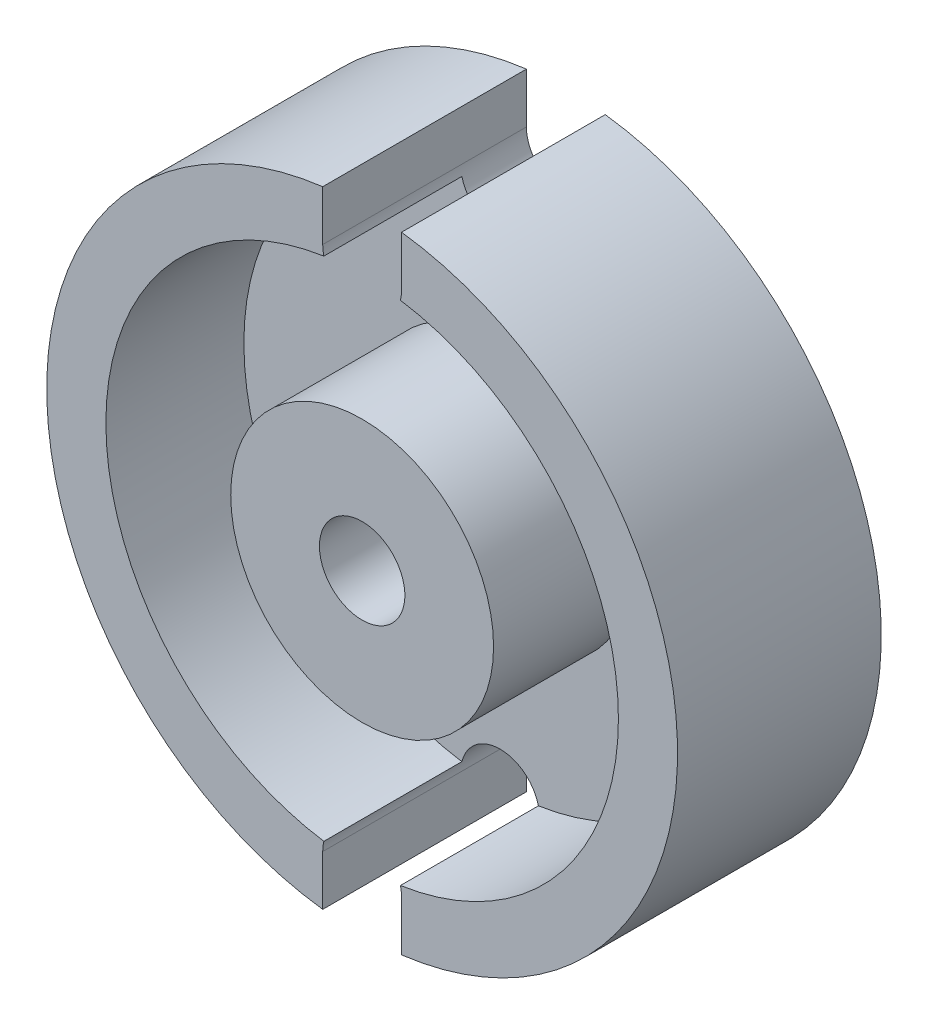
ISO-10303-21;
HEADER;
FILE_DESCRIPTION(('STEP AP214'),'2;1');
FILE_NAME('part.step','',(''),(''),'','','');
FILE_SCHEMA(('AUTOMOTIVE_DESIGN { 1 0 10303 214 1 1 1 1 }'));
ENDSEC;
DATA;
#1=APPLICATION_CONTEXT('core data for automotive mechanical design processes');
#2=APPLICATION_PROTOCOL_DEFINITION('international standard','automotive_design',2000,#1);
#3=PRODUCT_CONTEXT('',#1,'mechanical');
#4=PRODUCT('Part','Part','',(#3));
#5=PRODUCT_RELATED_PRODUCT_CATEGORY('part','',(#4));
#6=PRODUCT_DEFINITION_FORMATION('','',#4);
#7=PRODUCT_DEFINITION_CONTEXT('part definition',#1,'design');
#8=PRODUCT_DEFINITION('design','',#6,#7);
#9=PRODUCT_DEFINITION_SHAPE('','',#8);
#10=(LENGTH_UNIT() NAMED_UNIT(*) SI_UNIT(.MILLI.,.METRE.));
#11=(NAMED_UNIT(*) PLANE_ANGLE_UNIT() SI_UNIT($,.RADIAN.));
#12=(NAMED_UNIT(*) SI_UNIT($,.STERADIAN.) SOLID_ANGLE_UNIT());
#13=UNCERTAINTY_MEASURE_WITH_UNIT(LENGTH_MEASURE(1.E-05),#10,'distance_accuracy_value','');
#14=(GEOMETRIC_REPRESENTATION_CONTEXT(3) GLOBAL_UNCERTAINTY_ASSIGNED_CONTEXT((#13)) GLOBAL_UNIT_ASSIGNED_CONTEXT((#10,
#11,#12)) REPRESENTATION_CONTEXT('',''));
#15=CARTESIAN_POINT('',(0.,0.,0.));
#16=DIRECTION('',(0.,0.,1.));
#17=DIRECTION('',(1.,0.,0.));
#18=AXIS2_PLACEMENT_3D('',#15,#16,#17);
#19=CARTESIAN_POINT('',(0.,0.,15.5));
#20=DIRECTION('',(0.,0.,1.));
#21=DIRECTION('',(1.,0.,0.));
#22=AXIS2_PLACEMENT_3D('',#19,#20,#21);
#23=PLANE('',#22);
#24=DIRECTION('',(0.,1.,0.));
#25=VECTOR('',#24,1.);
#26=CARTESIAN_POINT('',(2.99999999999999,0.,15.5));
#27=LINE('',#26,#25);
#28=CARTESIAN_POINT('',(2.99999999999999,-23.8117617995813,15.5));
#29=VERTEX_POINT('',#28);
#30=CARTESIAN_POINT('',(2.99999999999999,-20.,15.5));
#31=VERTEX_POINT('',#30);
#32=EDGE_CURVE('E212',#29,#31,#27,.T.);
#33=ORIENTED_EDGE('',*,*,#32,.F.);
#34=CARTESIAN_POINT('',(0.,0.,15.5));
#35=DIRECTION('',(0.,0.,1.));
#36=DIRECTION('',(1.,0.,0.));
#37=AXIS2_PLACEMENT_3D('',#34,#35,#36);
#38=CIRCLE('',#37,24.);
#39=CARTESIAN_POINT('',(3.00000000000001,23.8117617995813,15.5));
#40=VERTEX_POINT('',#39);
#41=EDGE_CURVE('E142',#29,#40,#38,.T.);
#42=ORIENTED_EDGE('',*,*,#41,.T.);
#43=DIRECTION('',(0.,1.,0.));
#44=VECTOR('',#43,1.);
#45=CARTESIAN_POINT('',(2.99999999999999,0.,15.5));
#46=LINE('',#45,#44);
#47=CARTESIAN_POINT('',(3.00000000000001,20.,15.5));
#48=VERTEX_POINT('',#47);
#49=EDGE_CURVE('E190',#48,#40,#46,.T.);
#50=ORIENTED_EDGE('',*,*,#49,.F.);
#51=CARTESIAN_POINT('',(0.,20.,15.5));
#52=DIRECTION('',(0.,0.,1.));
#53=DIRECTION('',(1.,0.,0.));
#54=AXIS2_PLACEMENT_3D('',#51,#52,#53);
#55=CIRCLE('',#54,3.);
#56=CARTESIAN_POINT('',(2.9126274113762,19.28125,15.5));
#57=VERTEX_POINT('',#56);
#58=EDGE_CURVE('E194',#57,#48,#55,.T.);
#59=ORIENTED_EDGE('',*,*,#58,.F.);
#60=CARTESIAN_POINT('',(0.,0.,15.5));
#61=DIRECTION('',(0.,0.,1.));
#62=DIRECTION('',(1.,0.,0.));
#63=AXIS2_PLACEMENT_3D('',#60,#61,#62);
#64=CIRCLE('',#63,19.5);
#65=CARTESIAN_POINT('',(2.91262741137619,-19.28125,15.5));
#66=VERTEX_POINT('',#65);
#67=EDGE_CURVE('E181',#66,#57,#64,.T.);
#68=ORIENTED_EDGE('',*,*,#67,.F.);
#69=CARTESIAN_POINT('',(0.,-20.,15.5));
#70=DIRECTION('',(0.,0.,1.));
#71=DIRECTION('',(1.,0.,0.));
#72=AXIS2_PLACEMENT_3D('',#69,#70,#71);
#73=CIRCLE('',#72,3.);
#74=EDGE_CURVE('E215',#31,#66,#73,.T.);
#75=ORIENTED_EDGE('',*,*,#74,.F.);
#76=EDGE_LOOP('',(#33,#42,#50,#59,#68,#75));
#77=FACE_BOUND('',#76,.T.);
#78=ADVANCED_FACE('F27',(#77),#23,.T.);
#79=CARTESIAN_POINT('',(0.,0.,15.5));
#80=DIRECTION('',(0.,0.,-1.));
#81=DIRECTION('',(-1.,0.,0.));
#82=AXIS2_PLACEMENT_3D('',#79,#80,#81);
#83=CYLINDRICAL_SURFACE('',#82,24.);
#84=ORIENTED_EDGE('',*,*,#41,.F.);
#85=DIRECTION('',(0.,0.,-1.));
#86=VECTOR('',#85,1.);
#87=CARTESIAN_POINT('',(2.99999999999999,-23.8117617995813,15.5));
#88=LINE('',#87,#86);
#89=CARTESIAN_POINT('',(2.99999999999999,-23.8117617995813,0.));
#90=VERTEX_POINT('',#89);
#91=EDGE_CURVE('E11',#29,#90,#88,.T.);
#92=ORIENTED_EDGE('',*,*,#91,.T.);
#93=CARTESIAN_POINT('',(0.,0.,0.));
#94=DIRECTION('',(0.,0.,1.));
#95=DIRECTION('',(1.,0.,0.));
#96=AXIS2_PLACEMENT_3D('',#93,#94,#95);
#97=CIRCLE('',#96,24.);
#98=CARTESIAN_POINT('',(3.00000000000001,23.8117617995813,0.));
#99=VERTEX_POINT('',#98);
#100=EDGE_CURVE('E143',#90,#99,#97,.T.);
#101=ORIENTED_EDGE('',*,*,#100,.T.);
#102=DIRECTION('',(0.,0.,-1.));
#103=VECTOR('',#102,1.);
#104=CARTESIAN_POINT('',(3.00000000000001,23.8117617995813,15.5));
#105=LINE('',#104,#103);
#106=EDGE_CURVE('E153',#99,#40,#105,.F.);
#107=ORIENTED_EDGE('',*,*,#106,.T.);
#108=EDGE_LOOP('',(#84,#92,#101,#107));
#109=FACE_BOUND('',#108,.T.);
#110=ADVANCED_FACE('F232',(#109),#83,.T.);
#111=CARTESIAN_POINT('',(0.,0.,4.99999999999999));
#112=DIRECTION('',(0.,0.,0.999999999999999));
#113=DIRECTION('',(1.,0.,0.));
#114=AXIS2_PLACEMENT_3D('',#111,#112,#113);
#115=CYLINDRICAL_SURFACE('',#114,19.5);
#116=CARTESIAN_POINT('',(0.,0.,4.99999999999999));
#117=DIRECTION('',(0.,0.,1.));
#118=DIRECTION('',(1.,0.,0.));
#119=AXIS2_PLACEMENT_3D('',#116,#117,#118);
#120=CIRCLE('',#119,19.5);
#121=CARTESIAN_POINT('',(2.91262741137619,-19.28125,4.99999999999999));
#122=VERTEX_POINT('',#121);
#123=CARTESIAN_POINT('',(2.9126274113762,19.28125,4.99999999999999));
#124=VERTEX_POINT('',#123);
#125=EDGE_CURVE('E176',#122,#124,#120,.T.);
#126=ORIENTED_EDGE('',*,*,#125,.F.);
#127=DIRECTION('',(0.,0.,-1.));
#128=VECTOR('',#127,1.);
#129=CARTESIAN_POINT('',(2.91262741137619,-19.28125,10.25));
#130=LINE('',#129,#128);
#131=EDGE_CURVE('E42',#122,#66,#130,.F.);
#132=ORIENTED_EDGE('',*,*,#131,.T.);
#133=ORIENTED_EDGE('',*,*,#67,.T.);
#134=DIRECTION('',(0.,0.,-1.));
#135=VECTOR('',#134,1.);
#136=CARTESIAN_POINT('',(2.9126274113762,19.28125,10.25));
#137=LINE('',#136,#135);
#138=EDGE_CURVE('E197',#57,#124,#137,.T.);
#139=ORIENTED_EDGE('',*,*,#138,.T.);
#140=EDGE_LOOP('',(#126,#132,#133,#139));
#141=FACE_BOUND('',#140,.T.);
#142=ADVANCED_FACE('F246',(#141),#115,.F.);
#143=CARTESIAN_POINT('',(0.,0.,15.5));
#144=DIRECTION('',(0.,0.,1.));
#145=DIRECTION('',(1.,0.,0.));
#146=AXIS2_PLACEMENT_3D('',#143,#144,#145);
#147=CIRCLE('',#146,3.25);
#148=CARTESIAN_POINT('',(-3.25,0.,15.5));
#149=VERTEX_POINT('',#148);
#150=EDGE_CURVE('E147',#149,#149,#147,.T.);
#151=ORIENTED_EDGE('',*,*,#150,.F.);
#152=EDGE_LOOP('',(#151));
#153=FACE_BOUND('',#152,.T.);
#154=CARTESIAN_POINT('',(0.,0.,15.5));
#155=DIRECTION('',(0.,0.,1.));
#156=DIRECTION('',(1.,0.,0.));
#157=AXIS2_PLACEMENT_3D('',#154,#155,#156);
#158=CIRCLE('',#157,10.);
#159=CARTESIAN_POINT('',(10.,0.,15.5));
#160=VERTEX_POINT('',#159);
#161=EDGE_CURVE('E185',#160,#160,#158,.T.);
#162=ORIENTED_EDGE('',*,*,#161,.T.);
#163=EDGE_LOOP('',(#162));
#164=FACE_BOUND('',#163,.T.);
#165=ADVANCED_FACE('F248',(#153,#164),#23,.T.);
#166=CARTESIAN_POINT('',(-2.91262741137621,-19.28125,15.5));
#167=VERTEX_POINT('',#166);
#168=CARTESIAN_POINT('',(-3.00000000000001,-20.,15.5));
#169=VERTEX_POINT('',#168);
#170=EDGE_CURVE('E216',#167,#169,#73,.T.);
#171=ORIENTED_EDGE('',*,*,#170,.F.);
#172=CARTESIAN_POINT('',(-2.9126274113762,19.28125,15.5));
#173=VERTEX_POINT('',#172);
#174=EDGE_CURVE('E170',#173,#167,#64,.T.);
#175=ORIENTED_EDGE('',*,*,#174,.F.);
#176=CARTESIAN_POINT('',(-3.,20.,15.5));
#177=VERTEX_POINT('',#176);
#178=EDGE_CURVE('E193',#177,#173,#55,.T.);
#179=ORIENTED_EDGE('',*,*,#178,.F.);
#180=DIRECTION('',(0.,-1.,0.));
#181=VECTOR('',#180,1.);
#182=CARTESIAN_POINT('',(-3.00000000000001,0.,15.5));
#183=LINE('',#182,#181);
#184=CARTESIAN_POINT('',(-3.,23.8117617995813,15.5));
#185=VERTEX_POINT('',#184);
#186=EDGE_CURVE('E188',#185,#177,#183,.T.);
#187=ORIENTED_EDGE('',*,*,#186,.F.);
#188=CARTESIAN_POINT('',(-3.00000000000002,-23.8117617995814,15.5));
#189=VERTEX_POINT('',#188);
#190=EDGE_CURVE('E145',#185,#189,#38,.T.);
#191=ORIENTED_EDGE('',*,*,#190,.T.);
#192=DIRECTION('',(0.,-1.,0.));
#193=VECTOR('',#192,1.);
#194=CARTESIAN_POINT('',(-3.00000000000001,0.,15.5));
#195=LINE('',#194,#193);
#196=EDGE_CURVE('E123',#169,#189,#195,.T.);
#197=ORIENTED_EDGE('',*,*,#196,.F.);
#198=EDGE_LOOP('',(#171,#175,#179,#187,#191,#197));
#199=FACE_BOUND('',#198,.T.);
#200=ADVANCED_FACE('F254',(#199),#23,.T.);
#201=CARTESIAN_POINT('',(0.,0.,0.));
#202=DIRECTION('',(0.,0.,1.));
#203=DIRECTION('',(1.,0.,0.));
#204=AXIS2_PLACEMENT_3D('',#201,#202,#203);
#205=PLANE('',#204);
#206=ORIENTED_EDGE('',*,*,#100,.F.);
#207=DIRECTION('',(0.,-1.,0.));
#208=VECTOR('',#207,1.);
#209=CARTESIAN_POINT('',(2.99999999999999,-20.,0.));
#210=LINE('',#209,#208);
#211=CARTESIAN_POINT('',(2.99999999999999,-20.,0.));
#212=VERTEX_POINT('',#211);
#213=EDGE_CURVE('E221',#212,#90,#210,.T.);
#214=ORIENTED_EDGE('',*,*,#213,.F.);
#215=CARTESIAN_POINT('',(0.,-20.,0.));
#216=DIRECTION('',(0.,0.,-1.));
#217=DIRECTION('',(-1.,0.,0.));
#218=AXIS2_PLACEMENT_3D('',#215,#216,#217);
#219=CIRCLE('',#218,3.);
#220=CARTESIAN_POINT('',(-3.00000000000002,-20.,0.));
#221=VERTEX_POINT('',#220);
#222=EDGE_CURVE('E138',#221,#212,#219,.T.);
#223=ORIENTED_EDGE('',*,*,#222,.F.);
#224=DIRECTION('',(0.,1.,0.));
#225=VECTOR('',#224,1.);
#226=CARTESIAN_POINT('',(-3.00000000000002,-20.,0.));
#227=LINE('',#226,#225);
#228=CARTESIAN_POINT('',(-3.00000000000002,-23.8117617995814,0.));
#229=VERTEX_POINT('',#228);
#230=EDGE_CURVE('E120',#229,#221,#227,.T.);
#231=ORIENTED_EDGE('',*,*,#230,.F.);
#232=CARTESIAN_POINT('',(-3.,23.8117617995813,0.));
#233=VERTEX_POINT('',#232);
#234=EDGE_CURVE('E135',#233,#229,#97,.T.);
#235=ORIENTED_EDGE('',*,*,#234,.F.);
#236=DIRECTION('',(0.,1.,0.));
#237=VECTOR('',#236,1.);
#238=CARTESIAN_POINT('',(-3.,20.,0.));
#239=LINE('',#238,#237);
#240=CARTESIAN_POINT('',(-3.,20.,0.));
#241=VERTEX_POINT('',#240);
#242=EDGE_CURVE('E203',#241,#233,#239,.T.);
#243=ORIENTED_EDGE('',*,*,#242,.F.);
#244=CARTESIAN_POINT('',(0.,20.,0.));
#245=DIRECTION('',(0.,0.,-1.));
#246=DIRECTION('',(-1.,0.,0.));
#247=AXIS2_PLACEMENT_3D('',#244,#245,#246);
#248=CIRCLE('',#247,3.);
#249=CARTESIAN_POINT('',(3.00000000000001,20.,0.));
#250=VERTEX_POINT('',#249);
#251=EDGE_CURVE('E206',#250,#241,#248,.T.);
#252=ORIENTED_EDGE('',*,*,#251,.F.);
#253=DIRECTION('',(0.,-1.,0.));
#254=VECTOR('',#253,1.);
#255=CARTESIAN_POINT('',(3.00000000000001,20.,0.));
#256=LINE('',#255,#254);
#257=EDGE_CURVE('E209',#99,#250,#256,.T.);
#258=ORIENTED_EDGE('',*,*,#257,.F.);
#259=EDGE_LOOP('',(#206,#214,#223,#231,#235,#243,#252,#258));
#260=FACE_BOUND('',#259,.T.);
#261=CARTESIAN_POINT('',(0.,0.,0.));
#262=DIRECTION('',(0.,0.,1.));
#263=DIRECTION('',(1.,0.,0.));
#264=AXIS2_PLACEMENT_3D('',#261,#262,#263);
#265=CIRCLE('',#264,3.25);
#266=CARTESIAN_POINT('',(-3.25,0.,0.));
#267=VERTEX_POINT('',#266);
#268=EDGE_CURVE('E175',#267,#267,#265,.T.);
#269=ORIENTED_EDGE('',*,*,#268,.T.);
#270=EDGE_LOOP('',(#269));
#271=FACE_BOUND('',#270,.T.);
#272=ADVANCED_FACE('F132',(#260,#271),#205,.F.);
#273=ORIENTED_EDGE('',*,*,#234,.T.);
#274=DIRECTION('',(0.,0.,-1.));
#275=VECTOR('',#274,1.);
#276=CARTESIAN_POINT('',(-3.00000000000002,-23.8117617995814,15.5));
#277=LINE('',#276,#275);
#278=EDGE_CURVE('E35',#229,#189,#277,.F.);
#279=ORIENTED_EDGE('',*,*,#278,.T.);
#280=ORIENTED_EDGE('',*,*,#190,.F.);
#281=DIRECTION('',(0.,0.,-1.));
#282=VECTOR('',#281,1.);
#283=CARTESIAN_POINT('',(-3.,23.8117617995813,15.5));
#284=LINE('',#283,#282);
#285=EDGE_CURVE('E141',#185,#233,#284,.T.);
#286=ORIENTED_EDGE('',*,*,#285,.T.);
#287=EDGE_LOOP('',(#273,#279,#280,#286));
#288=FACE_BOUND('',#287,.T.);
#289=ADVANCED_FACE('F29',(#288),#83,.T.);
#290=CARTESIAN_POINT('',(0.,0.,15.5));
#291=DIRECTION('',(0.,0.,-1.));
#292=DIRECTION('',(-1.,0.,0.));
#293=AXIS2_PLACEMENT_3D('',#290,#291,#292);
#294=CYLINDRICAL_SURFACE('',#293,3.25);
#295=CARTESIAN_POINT('',(-3.25,0.,15.5));
#296=CARTESIAN_POINT('',(-3.25,0.,15.3385416666667));
#297=CARTESIAN_POINT('',(-3.25,0.,15.1770833333333));
#298=CARTESIAN_POINT('',(-3.25,0.,14.8541666666667));
#299=CARTESIAN_POINT('',(-3.25,0.,14.6927083333333));
#300=CARTESIAN_POINT('',(-3.25,0.,14.3697916666667));
#301=CARTESIAN_POINT('',(-3.25,0.,14.2083333333333));
#302=CARTESIAN_POINT('',(-3.25,0.,13.8854166666667));
#303=CARTESIAN_POINT('',(-3.25,0.,13.7239583333333));
#304=CARTESIAN_POINT('',(-3.25,0.,13.4010416666667));
#305=CARTESIAN_POINT('',(-3.25,0.,13.2395833333333));
#306=CARTESIAN_POINT('',(-3.25,0.,12.9166666666667));
#307=CARTESIAN_POINT('',(-3.25,0.,12.7552083333333));
#308=CARTESIAN_POINT('',(-3.25,0.,12.4322916666667));
#309=CARTESIAN_POINT('',(-3.25,0.,12.2708333333333));
#310=CARTESIAN_POINT('',(-3.25,0.,11.9479166666667));
#311=CARTESIAN_POINT('',(-3.25,0.,11.7864583333333));
#312=CARTESIAN_POINT('',(-3.25,0.,11.4635416666667));
#313=CARTESIAN_POINT('',(-3.25,0.,11.3020833333333));
#314=CARTESIAN_POINT('',(-3.25,0.,10.9791666666667));
#315=CARTESIAN_POINT('',(-3.25,0.,10.8177083333333));
#316=CARTESIAN_POINT('',(-3.25,0.,10.4947916666667));
#317=CARTESIAN_POINT('',(-3.25,0.,10.3333333333333));
#318=CARTESIAN_POINT('',(-3.25,0.,10.0104166666667));
#319=CARTESIAN_POINT('',(-3.25,0.,9.84895833333333));
#320=CARTESIAN_POINT('',(-3.25,0.,9.52604166666666));
#321=CARTESIAN_POINT('',(-3.25,0.,9.36458333333333));
#322=CARTESIAN_POINT('',(-3.25,0.,9.04166666666666));
#323=CARTESIAN_POINT('',(-3.25,0.,8.88020833333333));
#324=CARTESIAN_POINT('',(-3.25,0.,8.55729166666666));
#325=CARTESIAN_POINT('',(-3.25,0.,8.39583333333333));
#326=CARTESIAN_POINT('',(-3.25,0.,8.07291666666666));
#327=CARTESIAN_POINT('',(-3.25,0.,7.91145833333333));
#328=CARTESIAN_POINT('',(-3.25,0.,7.58854166666666));
#329=CARTESIAN_POINT('',(-3.25,0.,7.42708333333333));
#330=CARTESIAN_POINT('',(-3.25,0.,7.10416666666666));
#331=CARTESIAN_POINT('',(-3.25,0.,6.94270833333333));
#332=CARTESIAN_POINT('',(-3.25,0.,6.61979166666666));
#333=CARTESIAN_POINT('',(-3.25,0.,6.45833333333333));
#334=CARTESIAN_POINT('',(-3.25,0.,6.13541666666666));
#335=CARTESIAN_POINT('',(-3.25,0.,5.97395833333333));
#336=CARTESIAN_POINT('',(-3.25,0.,5.65104166666666));
#337=CARTESIAN_POINT('',(-3.25,0.,5.48958333333333));
#338=CARTESIAN_POINT('',(-3.25,0.,5.16666666666666));
#339=CARTESIAN_POINT('',(-3.25,0.,5.00520833333333));
#340=CARTESIAN_POINT('',(-3.25,0.,4.68229166666666));
#341=CARTESIAN_POINT('',(-3.25,0.,4.52083333333333));
#342=CARTESIAN_POINT('',(-3.25,0.,4.19791666666666));
#343=CARTESIAN_POINT('',(-3.25,0.,4.03645833333333));
#344=CARTESIAN_POINT('',(-3.25,0.,3.71354166666666));
#345=CARTESIAN_POINT('',(-3.25,0.,3.55208333333333));
#346=CARTESIAN_POINT('',(-3.25,0.,3.22916666666666));
#347=CARTESIAN_POINT('',(-3.25,0.,3.06770833333333));
#348=CARTESIAN_POINT('',(-3.25,0.,2.74479166666666));
#349=CARTESIAN_POINT('',(-3.25,0.,2.58333333333333));
#350=CARTESIAN_POINT('',(-3.25,0.,2.26041666666667));
#351=CARTESIAN_POINT('',(-3.25,0.,2.09895833333333));
#352=CARTESIAN_POINT('',(-3.25,0.,1.77604166666667));
#353=CARTESIAN_POINT('',(-3.25,0.,1.61458333333333));
#354=CARTESIAN_POINT('',(-3.25,0.,1.29166666666667));
#355=CARTESIAN_POINT('',(-3.25,0.,1.13020833333333));
#356=CARTESIAN_POINT('',(-3.25,0.,0.807291666666666));
#357=CARTESIAN_POINT('',(-3.25,0.,0.645833333333333));
#358=CARTESIAN_POINT('',(-3.25,0.,0.322916666666667));
#359=CARTESIAN_POINT('',(-3.25,0.,0.161458333333333));
#360=CARTESIAN_POINT('',(-3.25,0.,0.));
#361=B_SPLINE_CURVE_WITH_KNOTS('',3,(#295,#296,#297,#298,#299,#300,#301,#302,#303,#304,#305,
#306,#307,#308,#309,#310,#311,#312,#313,#314,#315,#316,#317,#318,#319,#320,#321,#322,#323,#324,
#325,#326,#327,#328,#329,#330,#331,#332,#333,#334,#335,#336,#337,#338,#339,#340,#341,#342,#343,
#344,#345,#346,#347,#348,#349,#350,#351,#352,#353,#354,#355,#356,#357,#358,#359,#360),
.UNSPECIFIED.,.F.,.F.,(4,2,2,2,2,2,2,2,2,2,2,2,2,2,2,2,2,2,2,2,2,2,2,2,2,2,2,2,2,2,2,2,4),(0.,
0.484374999999999,0.968749999999999,1.453125,1.9375,2.421875,2.90625,3.390625,3.875,4.359375,
4.84375,5.328125,5.8125,6.296875,6.78125,7.265625,7.74999999999999,8.23437499999999,8.71875,
9.203125,9.68749999999999,10.171875,10.65625,11.140625,11.625,12.109375,12.59375,13.078125,
13.5625,14.046875,14.53125,15.015625,15.5),.UNSPECIFIED.);
#362=EDGE_CURVE('BSEAM259',#149,#267,#361,.T.);
#363=ORIENTED_EDGE('',*,*,#150,.T.);
#364=ORIENTED_EDGE('',*,*,#268,.F.);
#365=ORIENTED_EDGE('',*,*,#362,.T.);
#366=ORIENTED_EDGE('',*,*,#362,.F.);
#367=EDGE_LOOP('',(#363,#365,#364,#366));
#368=FACE_BOUND('',#367,.T.);
#369=ADVANCED_FACE('F259',(#368),#294,.F.);
#370=ORIENTED_EDGE('',*,*,#174,.T.);
#371=DIRECTION('',(0.,0.,-1.));
#372=VECTOR('',#371,1.);
#373=CARTESIAN_POINT('',(-2.91262741137621,-19.28125,10.25));
#374=LINE('',#373,#372);
#375=CARTESIAN_POINT('',(-2.91262741137622,-19.28125,5.));
#376=VERTEX_POINT('',#375);
#377=EDGE_CURVE('E159',#167,#376,#374,.T.);
#378=ORIENTED_EDGE('',*,*,#377,.T.);
#379=CARTESIAN_POINT('',(-2.9126274113762,19.28125,5.));
#380=VERTEX_POINT('',#379);
#381=EDGE_CURVE('E168',#380,#376,#120,.T.);
#382=ORIENTED_EDGE('',*,*,#381,.F.);
#383=DIRECTION('',(0.,0.,-1.));
#384=VECTOR('',#383,1.);
#385=CARTESIAN_POINT('',(-2.91262741137619,19.28125,10.25));
#386=LINE('',#385,#384);
#387=EDGE_CURVE('E50',#380,#173,#386,.F.);
#388=ORIENTED_EDGE('',*,*,#387,.T.);
#389=EDGE_LOOP('',(#370,#378,#382,#388));
#390=FACE_BOUND('',#389,.T.);
#391=ADVANCED_FACE('F167',(#390),#115,.F.);
#392=CARTESIAN_POINT('',(0.,0.,4.99999999999999));
#393=DIRECTION('',(0.,0.,1.));
#394=DIRECTION('',(1.,0.,0.));
#395=AXIS2_PLACEMENT_3D('',#392,#393,#394);
#396=PLANE('',#395);
#397=CARTESIAN_POINT('',(0.,-20.,5.));
#398=DIRECTION('',(0.,0.,1.));
#399=DIRECTION('',(1.,0.,0.));
#400=AXIS2_PLACEMENT_3D('',#397,#398,#399);
#401=CIRCLE('',#400,3.);
#402=EDGE_CURVE('E128',#122,#376,#401,.T.);
#403=ORIENTED_EDGE('',*,*,#402,.F.);
#404=ORIENTED_EDGE('',*,*,#125,.T.);
#405=CARTESIAN_POINT('',(0.,20.,4.99999999999999));
#406=DIRECTION('',(0.,0.,1.));
#407=DIRECTION('',(1.,0.,0.));
#408=AXIS2_PLACEMENT_3D('',#405,#406,#407);
#409=CIRCLE('',#408,3.);
#410=EDGE_CURVE('E151',#380,#124,#409,.T.);
#411=ORIENTED_EDGE('',*,*,#410,.F.);
#412=ORIENTED_EDGE('',*,*,#381,.T.);
#413=EDGE_LOOP('',(#403,#404,#411,#412));
#414=FACE_BOUND('',#413,.T.);
#415=CARTESIAN_POINT('',(0.,0.,4.99999999999999));
#416=DIRECTION('',(0.,0.,1.));
#417=DIRECTION('',(1.,0.,0.));
#418=AXIS2_PLACEMENT_3D('',#415,#416,#417);
#419=CIRCLE('',#418,10.);
#420=CARTESIAN_POINT('',(10.,0.,4.99999999999999));
#421=VERTEX_POINT('',#420);
#422=EDGE_CURVE('E182',#421,#421,#419,.T.);
#423=ORIENTED_EDGE('',*,*,#422,.F.);
#424=EDGE_LOOP('',(#423));
#425=FACE_BOUND('',#424,.T.);
#426=ADVANCED_FACE('F173',(#414,#425),#396,.T.);
#427=CARTESIAN_POINT('',(0.,0.,4.99999999999999));
#428=DIRECTION('',(0.,0.,0.999999999999999));
#429=DIRECTION('',(1.,0.,0.));
#430=AXIS2_PLACEMENT_3D('',#427,#428,#429);
#431=CYLINDRICAL_SURFACE('',#430,10.);
#432=CARTESIAN_POINT('',(10.,0.,4.99999999999999));
#433=CARTESIAN_POINT('',(10.,0.,5.10937499999999));
#434=CARTESIAN_POINT('',(10.,0.,5.21874999999999));
#435=CARTESIAN_POINT('',(10.,0.,5.43749999999999));
#436=CARTESIAN_POINT('',(10.,0.,5.54687499999999));
#437=CARTESIAN_POINT('',(10.,0.,5.76562499999999));
#438=CARTESIAN_POINT('',(10.,0.,5.87499999999999));
#439=CARTESIAN_POINT('',(10.,0.,6.09374999999999));
#440=CARTESIAN_POINT('',(10.,0.,6.20312499999999));
#441=CARTESIAN_POINT('',(10.,0.,6.42187499999999));
#442=CARTESIAN_POINT('',(10.,0.,6.53124999999999));
#443=CARTESIAN_POINT('',(10.,0.,6.74999999999999));
#444=CARTESIAN_POINT('',(10.,0.,6.85937499999999));
#445=CARTESIAN_POINT('',(10.,0.,7.07812499999999));
#446=CARTESIAN_POINT('',(10.,0.,7.18749999999999));
#447=CARTESIAN_POINT('',(10.,0.,7.40624999999999));
#448=CARTESIAN_POINT('',(10.,0.,7.51562499999999));
#449=CARTESIAN_POINT('',(10.,0.,7.73437499999999));
#450=CARTESIAN_POINT('',(10.,0.,7.84374999999999));
#451=CARTESIAN_POINT('',(10.,0.,8.06249999999999));
#452=CARTESIAN_POINT('',(10.,0.,8.17187499999999));
#453=CARTESIAN_POINT('',(10.,0.,8.39062499999999));
#454=CARTESIAN_POINT('',(10.,0.,8.49999999999999));
#455=CARTESIAN_POINT('',(10.,0.,8.71874999999999));
#456=CARTESIAN_POINT('',(10.,0.,8.82812499999999));
#457=CARTESIAN_POINT('',(10.,0.,9.04687499999999));
#458=CARTESIAN_POINT('',(10.,0.,9.15624999999999));
#459=CARTESIAN_POINT('',(10.,0.,9.37499999999999));
#460=CARTESIAN_POINT('',(10.,0.,9.48437499999999));
#461=CARTESIAN_POINT('',(10.,0.,9.70312499999999));
#462=CARTESIAN_POINT('',(10.,0.,9.81249999999999));
#463=CARTESIAN_POINT('',(10.,0.,10.03125));
#464=CARTESIAN_POINT('',(10.,0.,10.140625));
#465=CARTESIAN_POINT('',(10.,0.,10.359375));
#466=CARTESIAN_POINT('',(10.,0.,10.46875));
#467=CARTESIAN_POINT('',(10.,0.,10.6875));
#468=CARTESIAN_POINT('',(10.,0.,10.796875));
#469=CARTESIAN_POINT('',(10.,0.,11.015625));
#470=CARTESIAN_POINT('',(10.,0.,11.125));
#471=CARTESIAN_POINT('',(10.,0.,11.34375));
#472=CARTESIAN_POINT('',(10.,0.,11.453125));
#473=CARTESIAN_POINT('',(10.,0.,11.671875));
#474=CARTESIAN_POINT('',(10.,0.,11.78125));
#475=CARTESIAN_POINT('',(10.,0.,12.));
#476=CARTESIAN_POINT('',(10.,0.,12.109375));
#477=CARTESIAN_POINT('',(10.,0.,12.328125));
#478=CARTESIAN_POINT('',(10.,0.,12.4375));
#479=CARTESIAN_POINT('',(10.,0.,12.65625));
#480=CARTESIAN_POINT('',(10.,0.,12.765625));
#481=CARTESIAN_POINT('',(10.,0.,12.984375));
#482=CARTESIAN_POINT('',(10.,0.,13.09375));
#483=CARTESIAN_POINT('',(10.,0.,13.3125));
#484=CARTESIAN_POINT('',(10.,0.,13.421875));
#485=CARTESIAN_POINT('',(10.,0.,13.640625));
#486=CARTESIAN_POINT('',(10.,0.,13.75));
#487=CARTESIAN_POINT('',(10.,0.,13.96875));
#488=CARTESIAN_POINT('',(10.,0.,14.078125));
#489=CARTESIAN_POINT('',(10.,0.,14.296875));
#490=CARTESIAN_POINT('',(10.,0.,14.40625));
#491=CARTESIAN_POINT('',(10.,0.,14.625));
#492=CARTESIAN_POINT('',(10.,0.,14.734375));
#493=CARTESIAN_POINT('',(10.,0.,14.953125));
#494=CARTESIAN_POINT('',(10.,0.,15.0625));
#495=CARTESIAN_POINT('',(10.,0.,15.28125));
#496=CARTESIAN_POINT('',(10.,0.,15.390625));
#497=CARTESIAN_POINT('',(10.,0.,15.5));
#498=B_SPLINE_CURVE_WITH_KNOTS('',3,(#432,#433,#434,#435,#436,#437,#438,#439,#440,#441,#442,
#443,#444,#445,#446,#447,#448,#449,#450,#451,#452,#453,#454,#455,#456,#457,#458,#459,#460,#461,
#462,#463,#464,#465,#466,#467,#468,#469,#470,#471,#472,#473,#474,#475,#476,#477,#478,#479,#480,
#481,#482,#483,#484,#485,#486,#487,#488,#489,#490,#491,#492,#493,#494,#495,#496,#497),
.UNSPECIFIED.,.F.,.F.,(4,2,2,2,2,2,2,2,2,2,2,2,2,2,2,2,2,2,2,2,2,2,2,2,2,2,2,2,2,2,2,2,4),(0.,
0.328124999999999,0.65625,0.984374999999999,1.3125,1.640625,1.96875,2.296875,2.625,2.953125,
3.28125,3.609375,3.9375,4.265625,4.59375,4.921875,5.25,5.578125,5.90625,6.234375,6.5625,
6.890625,7.21875,7.546875,7.875,8.203125,8.53125,8.859375,9.1875,9.515625,9.84375,10.171875,
10.5),.UNSPECIFIED.);
#499=EDGE_CURVE('BSEAM274',#421,#160,#498,.T.);
#500=ORIENTED_EDGE('',*,*,#422,.T.);
#501=ORIENTED_EDGE('',*,*,#161,.F.);
#502=ORIENTED_EDGE('',*,*,#499,.T.);
#503=ORIENTED_EDGE('',*,*,#499,.F.);
#504=EDGE_LOOP('',(#500,#502,#501,#503));
#505=FACE_BOUND('',#504,.T.);
#506=ADVANCED_FACE('F274',(#505),#431,.T.);
#507=CARTESIAN_POINT('',(-3.,20.,20.));
#508=DIRECTION('',(-1.,0.,0.));
#509=DIRECTION('',(0.,0.,1.));
#510=AXIS2_PLACEMENT_3D('',#507,#508,#509);
#511=PLANE('',#510);
#512=ORIENTED_EDGE('',*,*,#186,.T.);
#513=DIRECTION('',(0.,0.,-1.));
#514=VECTOR('',#513,1.);
#515=CARTESIAN_POINT('',(-3.,20.,20.));
#516=LINE('',#515,#514);
#517=EDGE_CURVE('E200',#177,#241,#516,.T.);
#518=ORIENTED_EDGE('',*,*,#517,.T.);
#519=ORIENTED_EDGE('',*,*,#242,.T.);
#520=ORIENTED_EDGE('',*,*,#285,.F.);
#521=EDGE_LOOP('',(#512,#518,#519,#520));
#522=FACE_BOUND('',#521,.T.);
#523=ADVANCED_FACE('F272',(#522),#511,.F.);
#524=CARTESIAN_POINT('',(0.,20.,20.));
#525=DIRECTION('',(0.,0.,-1.));
#526=DIRECTION('',(-1.,0.,0.));
#527=AXIS2_PLACEMENT_3D('',#524,#525,#526);
#528=CYLINDRICAL_SURFACE('',#527,3.);
#529=ORIENTED_EDGE('',*,*,#178,.T.);
#530=ORIENTED_EDGE('',*,*,#387,.F.);
#531=ORIENTED_EDGE('',*,*,#410,.T.);
#532=ORIENTED_EDGE('',*,*,#138,.F.);
#533=ORIENTED_EDGE('',*,*,#58,.T.);
#534=DIRECTION('',(0.,0.,-1.));
#535=VECTOR('',#534,1.);
#536=CARTESIAN_POINT('',(3.00000000000001,20.,20.));
#537=LINE('',#536,#535);
#538=EDGE_CURVE('E201',#48,#250,#537,.T.);
#539=ORIENTED_EDGE('',*,*,#538,.T.);
#540=ORIENTED_EDGE('',*,*,#251,.T.);
#541=ORIENTED_EDGE('',*,*,#517,.F.);
#542=EDGE_LOOP('',(#529,#530,#531,#532,#533,#539,#540,#541));
#543=FACE_BOUND('',#542,.T.);
#544=ADVANCED_FACE('F241',(#543),#528,.F.);
#545=CARTESIAN_POINT('',(3.00000000000001,20.,20.));
#546=DIRECTION('',(1.,0.,0.));
#547=DIRECTION('',(0.,1.,0.));
#548=AXIS2_PLACEMENT_3D('',#545,#546,#547);
#549=PLANE('',#548);
#550=ORIENTED_EDGE('',*,*,#49,.T.);
#551=ORIENTED_EDGE('',*,*,#106,.F.);
#552=ORIENTED_EDGE('',*,*,#257,.T.);
#553=ORIENTED_EDGE('',*,*,#538,.F.);
#554=EDGE_LOOP('',(#550,#551,#552,#553));
#555=FACE_BOUND('',#554,.T.);
#556=ADVANCED_FACE('F239',(#555),#549,.F.);
#557=CARTESIAN_POINT('',(2.99999999999999,-20.,20.));
#558=DIRECTION('',(1.,0.,0.));
#559=DIRECTION('',(0.,1.,0.));
#560=AXIS2_PLACEMENT_3D('',#557,#558,#559);
#561=PLANE('',#560);
#562=ORIENTED_EDGE('',*,*,#32,.T.);
#563=DIRECTION('',(0.,0.,-1.));
#564=VECTOR('',#563,1.);
#565=CARTESIAN_POINT('',(2.99999999999999,-20.,20.));
#566=LINE('',#565,#564);
#567=EDGE_CURVE('E171',#31,#212,#566,.T.);
#568=ORIENTED_EDGE('',*,*,#567,.T.);
#569=ORIENTED_EDGE('',*,*,#213,.T.);
#570=ORIENTED_EDGE('',*,*,#91,.F.);
#571=EDGE_LOOP('',(#562,#568,#569,#570));
#572=FACE_BOUND('',#571,.T.);
#573=ADVANCED_FACE('F228',(#572),#561,.F.);
#574=CARTESIAN_POINT('',(0.,-20.,20.));
#575=DIRECTION('',(0.,0.,-1.));
#576=DIRECTION('',(-1.,0.,0.));
#577=AXIS2_PLACEMENT_3D('',#574,#575,#576);
#578=CYLINDRICAL_SURFACE('',#577,3.);
#579=ORIENTED_EDGE('',*,*,#74,.T.);
#580=ORIENTED_EDGE('',*,*,#131,.F.);
#581=ORIENTED_EDGE('',*,*,#402,.T.);
#582=ORIENTED_EDGE('',*,*,#377,.F.);
#583=ORIENTED_EDGE('',*,*,#170,.T.);
#584=DIRECTION('',(0.,0.,-1.));
#585=VECTOR('',#584,1.);
#586=CARTESIAN_POINT('',(-3.00000000000001,-20.,20.));
#587=LINE('',#586,#585);
#588=EDGE_CURVE('E219',#169,#221,#587,.T.);
#589=ORIENTED_EDGE('',*,*,#588,.T.);
#590=ORIENTED_EDGE('',*,*,#222,.T.);
#591=ORIENTED_EDGE('',*,*,#567,.F.);
#592=EDGE_LOOP('',(#579,#580,#581,#582,#583,#589,#590,#591));
#593=FACE_BOUND('',#592,.T.);
#594=ADVANCED_FACE('F158',(#593),#578,.F.);
#595=CARTESIAN_POINT('',(-3.00000000000001,-20.,20.));
#596=DIRECTION('',(-1.,0.,0.));
#597=DIRECTION('',(0.,0.,1.));
#598=AXIS2_PLACEMENT_3D('',#595,#596,#597);
#599=PLANE('',#598);
#600=ORIENTED_EDGE('',*,*,#196,.T.);
#601=ORIENTED_EDGE('',*,*,#278,.F.);
#602=ORIENTED_EDGE('',*,*,#230,.T.);
#603=ORIENTED_EDGE('',*,*,#588,.F.);
#604=EDGE_LOOP('',(#600,#601,#602,#603));
#605=FACE_BOUND('',#604,.T.);
#606=ADVANCED_FACE('F118',(#605),#599,.F.);
#607=CLOSED_SHELL('',(#78,#110,#142,#165,#200,#272,#289,#369,#391,#426,#506,#523,#544,#556,#573,
#594,#606));
#608=MANIFOLD_SOLID_BREP('B2',#607);
#609=ADVANCED_BREP_SHAPE_REPRESENTATION('',(#18,#608),#14);
#610=SHAPE_DEFINITION_REPRESENTATION(#9,#609);
ENDSEC;
END-ISO-10303-21;
